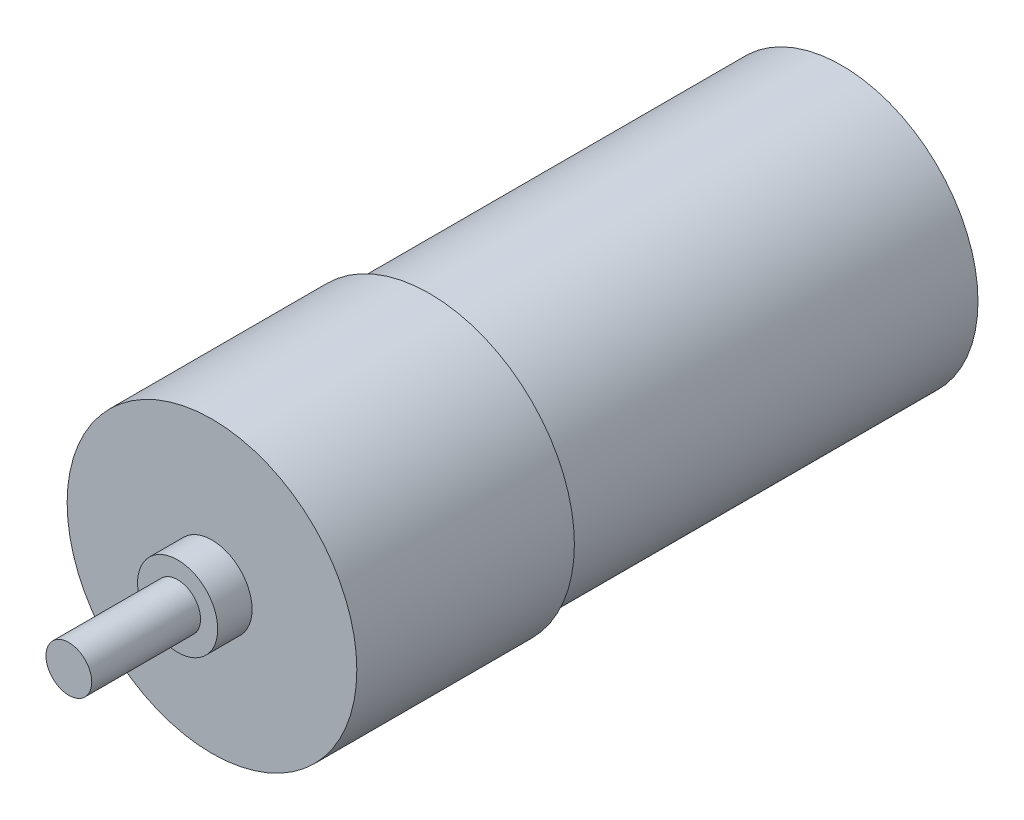
ISO-10303-21;
HEADER;
FILE_DESCRIPTION(('STEP AP214'),'2;1');
FILE_NAME('part.step','',(''),(''),'','','');
FILE_SCHEMA(('AUTOMOTIVE_DESIGN { 1 0 10303 214 1 1 1 1 }'));
ENDSEC;
DATA;
#1=APPLICATION_CONTEXT('core data for automotive mechanical design processes');
#2=APPLICATION_PROTOCOL_DEFINITION('international standard','automotive_design',2000,#1);
#3=PRODUCT_CONTEXT('',#1,'mechanical');
#4=PRODUCT('Part','Part','',(#3));
#5=PRODUCT_RELATED_PRODUCT_CATEGORY('part','',(#4));
#6=PRODUCT_DEFINITION_FORMATION('','',#4);
#7=PRODUCT_DEFINITION_CONTEXT('part definition',#1,'design');
#8=PRODUCT_DEFINITION('design','',#6,#7);
#9=PRODUCT_DEFINITION_SHAPE('','',#8);
#10=(LENGTH_UNIT() NAMED_UNIT(*) SI_UNIT(.MILLI.,.METRE.));
#11=(NAMED_UNIT(*) PLANE_ANGLE_UNIT() SI_UNIT($,.RADIAN.));
#12=(NAMED_UNIT(*) SI_UNIT($,.STERADIAN.) SOLID_ANGLE_UNIT());
#13=UNCERTAINTY_MEASURE_WITH_UNIT(LENGTH_MEASURE(1.E-05),#10,'distance_accuracy_value','');
#14=(GEOMETRIC_REPRESENTATION_CONTEXT(3) GLOBAL_UNCERTAINTY_ASSIGNED_CONTEXT((#13)) GLOBAL_UNIT_ASSIGNED_CONTEXT((#10,
#11,#12)) REPRESENTATION_CONTEXT('',''));
#15=CARTESIAN_POINT('',(0.,0.,0.));
#16=DIRECTION('',(0.,0.,1.));
#17=DIRECTION('',(1.,0.,0.));
#18=AXIS2_PLACEMENT_3D('',#15,#16,#17);
#19=CARTESIAN_POINT('',(0.,0.,36.));
#20=DIRECTION('',(0.,0.,-1.));
#21=DIRECTION('',(-1.,0.,0.));
#22=AXIS2_PLACEMENT_3D('',#19,#20,#21);
#23=CYLINDRICAL_SURFACE('',#22,11.9);
#24=CARTESIAN_POINT('',(0.,0.,36.));
#25=DIRECTION('',(0.,0.,1.));
#26=DIRECTION('',(1.,0.,0.));
#27=AXIS2_PLACEMENT_3D('',#24,#25,#26);
#28=CIRCLE('',#27,11.9);
#29=CARTESIAN_POINT('',(11.9,0.,36.));
#30=VERTEX_POINT('',#29);
#31=EDGE_CURVE('E10',#30,#30,#28,.T.);
#32=ORIENTED_EDGE('',*,*,#31,.F.);
#33=EDGE_LOOP('',(#32));
#34=FACE_BOUND('',#33,.T.);
#35=CARTESIAN_POINT('',(0.,0.,0.));
#36=DIRECTION('',(0.,0.,1.));
#37=DIRECTION('',(1.,0.,0.));
#38=AXIS2_PLACEMENT_3D('',#35,#36,#37);
#39=CIRCLE('',#38,11.9);
#40=CARTESIAN_POINT('',(11.9,0.,0.));
#41=VERTEX_POINT('',#40);
#42=EDGE_CURVE('E34',#41,#41,#39,.T.);
#43=ORIENTED_EDGE('',*,*,#42,.T.);
#44=EDGE_LOOP('',(#43));
#45=FACE_BOUND('',#44,.T.);
#46=ADVANCED_FACE('F31',(#34,#45),#23,.T.);
#47=CARTESIAN_POINT('',(0.,0.,0.));
#48=DIRECTION('',(0.,0.,1.));
#49=DIRECTION('',(1.,0.,0.));
#50=AXIS2_PLACEMENT_3D('',#47,#48,#49);
#51=PLANE('',#50);
#52=ORIENTED_EDGE('',*,*,#42,.F.);
#53=EDGE_LOOP('',(#52));
#54=FACE_BOUND('',#53,.T.);
#55=ADVANCED_FACE('F91',(#54),#51,.F.);
#56=CARTESIAN_POINT('',(0.,0.,55.));
#57=DIRECTION('',(0.,0.,-1.));
#58=DIRECTION('',(-1.,0.,0.));
#59=AXIS2_PLACEMENT_3D('',#56,#57,#58);
#60=CYLINDRICAL_SURFACE('',#59,12.65);
#61=CARTESIAN_POINT('',(0.,0.,55.));
#62=DIRECTION('',(0.,0.,1.));
#63=DIRECTION('',(1.,0.,0.));
#64=AXIS2_PLACEMENT_3D('',#61,#62,#63);
#65=CIRCLE('',#64,12.65);
#66=CARTESIAN_POINT('',(12.65,0.,55.));
#67=VERTEX_POINT('',#66);
#68=EDGE_CURVE('E41',#67,#67,#65,.T.);
#69=ORIENTED_EDGE('',*,*,#68,.F.);
#70=EDGE_LOOP('',(#69));
#71=FACE_BOUND('',#70,.T.);
#72=CARTESIAN_POINT('',(0.,0.,36.));
#73=DIRECTION('',(0.,0.,1.));
#74=DIRECTION('',(1.,0.,0.));
#75=AXIS2_PLACEMENT_3D('',#72,#73,#74);
#76=CIRCLE('',#75,12.65);
#77=CARTESIAN_POINT('',(12.65,0.,36.));
#78=VERTEX_POINT('',#77);
#79=EDGE_CURVE('E43',#78,#78,#76,.T.);
#80=ORIENTED_EDGE('',*,*,#79,.T.);
#81=EDGE_LOOP('',(#80));
#82=FACE_BOUND('',#81,.T.);
#83=ADVANCED_FACE('F85',(#71,#82),#60,.T.);
#84=CARTESIAN_POINT('',(0.,0.,55.));
#85=DIRECTION('',(0.,0.,1.));
#86=DIRECTION('',(1.,0.,0.));
#87=AXIS2_PLACEMENT_3D('',#84,#85,#86);
#88=PLANE('',#87);
#89=CARTESIAN_POINT('',(0.,0.,55.));
#90=DIRECTION('',(0.,0.,1.));
#91=DIRECTION('',(1.,0.,0.));
#92=AXIS2_PLACEMENT_3D('',#89,#90,#91);
#93=CIRCLE('',#92,3.5);
#94=CARTESIAN_POINT('',(3.5,0.,55.));
#95=VERTEX_POINT('',#94);
#96=EDGE_CURVE('E49',#95,#95,#93,.T.);
#97=ORIENTED_EDGE('',*,*,#96,.F.);
#98=EDGE_LOOP('',(#97));
#99=FACE_BOUND('',#98,.T.);
#100=ORIENTED_EDGE('',*,*,#68,.T.);
#101=EDGE_LOOP('',(#100));
#102=FACE_BOUND('',#101,.T.);
#103=ADVANCED_FACE('F82',(#99,#102),#88,.T.);
#104=CARTESIAN_POINT('',(0.,0.,36.));
#105=DIRECTION('',(0.,0.,1.));
#106=DIRECTION('',(1.,0.,0.));
#107=AXIS2_PLACEMENT_3D('',#104,#105,#106);
#108=PLANE('',#107);
#109=ORIENTED_EDGE('',*,*,#31,.T.);
#110=EDGE_LOOP('',(#109));
#111=FACE_BOUND('',#110,.T.);
#112=ORIENTED_EDGE('',*,*,#79,.F.);
#113=EDGE_LOOP('',(#112));
#114=FACE_BOUND('',#113,.T.);
#115=ADVANCED_FACE('F78',(#111,#114),#108,.F.);
#116=CARTESIAN_POINT('',(0.,0.,58.));
#117=DIRECTION('',(0.,0.,-1.));
#118=DIRECTION('',(-1.,0.,0.));
#119=AXIS2_PLACEMENT_3D('',#116,#117,#118);
#120=CYLINDRICAL_SURFACE('',#119,3.5);
#121=CARTESIAN_POINT('',(0.,0.,58.));
#122=DIRECTION('',(0.,0.,1.));
#123=DIRECTION('',(1.,0.,0.));
#124=AXIS2_PLACEMENT_3D('',#121,#122,#123);
#125=CIRCLE('',#124,3.5);
#126=CARTESIAN_POINT('',(3.5,0.,58.));
#127=VERTEX_POINT('',#126);
#128=EDGE_CURVE('E46',#127,#127,#125,.T.);
#129=ORIENTED_EDGE('',*,*,#128,.F.);
#130=EDGE_LOOP('',(#129));
#131=FACE_BOUND('',#130,.T.);
#132=ORIENTED_EDGE('',*,*,#96,.T.);
#133=EDGE_LOOP('',(#132));
#134=FACE_BOUND('',#133,.T.);
#135=ADVANCED_FACE('F72',(#131,#134),#120,.T.);
#136=CARTESIAN_POINT('',(0.,0.,58.));
#137=DIRECTION('',(0.,0.,1.));
#138=DIRECTION('',(1.,0.,0.));
#139=AXIS2_PLACEMENT_3D('',#136,#137,#138);
#140=PLANE('',#139);
#141=CARTESIAN_POINT('',(0.,0.,58.));
#142=DIRECTION('',(0.,0.,1.));
#143=DIRECTION('',(1.,0.,0.));
#144=AXIS2_PLACEMENT_3D('',#141,#142,#143);
#145=CIRCLE('',#144,2.);
#146=CARTESIAN_POINT('',(2.,0.,58.));
#147=VERTEX_POINT('',#146);
#148=EDGE_CURVE('E55',#147,#147,#145,.T.);
#149=ORIENTED_EDGE('',*,*,#148,.F.);
#150=EDGE_LOOP('',(#149));
#151=FACE_BOUND('',#150,.T.);
#152=ORIENTED_EDGE('',*,*,#128,.T.);
#153=EDGE_LOOP('',(#152));
#154=FACE_BOUND('',#153,.T.);
#155=ADVANCED_FACE('F66',(#151,#154),#140,.T.);
#156=CARTESIAN_POINT('',(0.,0.,67.5));
#157=DIRECTION('',(0.,0.,-1.));
#158=DIRECTION('',(-1.,0.,0.));
#159=AXIS2_PLACEMENT_3D('',#156,#157,#158);
#160=CYLINDRICAL_SURFACE('',#159,2.);
#161=CARTESIAN_POINT('',(0.,0.,67.5));
#162=DIRECTION('',(0.,0.,1.));
#163=DIRECTION('',(1.,0.,0.));
#164=AXIS2_PLACEMENT_3D('',#161,#162,#163);
#165=CIRCLE('',#164,2.);
#166=CARTESIAN_POINT('',(2.,0.,67.5));
#167=VERTEX_POINT('',#166);
#168=EDGE_CURVE('E52',#167,#167,#165,.T.);
#169=ORIENTED_EDGE('',*,*,#168,.F.);
#170=EDGE_LOOP('',(#169));
#171=FACE_BOUND('',#170,.T.);
#172=ORIENTED_EDGE('',*,*,#148,.T.);
#173=EDGE_LOOP('',(#172));
#174=FACE_BOUND('',#173,.T.);
#175=ADVANCED_FACE('F63',(#171,#174),#160,.T.);
#176=CARTESIAN_POINT('',(0.,0.,67.5));
#177=DIRECTION('',(0.,0.,1.));
#178=DIRECTION('',(1.,0.,0.));
#179=AXIS2_PLACEMENT_3D('',#176,#177,#178);
#180=PLANE('',#179);
#181=ORIENTED_EDGE('',*,*,#168,.T.);
#182=EDGE_LOOP('',(#181));
#183=FACE_BOUND('',#182,.T.);
#184=ADVANCED_FACE('F61',(#183),#180,.T.);
#185=CLOSED_SHELL('',(#46,#55,#83,#103,#115,#135,#155,#175,#184));
#186=MANIFOLD_SOLID_BREP('B2',#185);
#187=ADVANCED_BREP_SHAPE_REPRESENTATION('',(#18,#186),#14);
#188=SHAPE_DEFINITION_REPRESENTATION(#9,#187);
ENDSEC;
END-ISO-10303-21;
